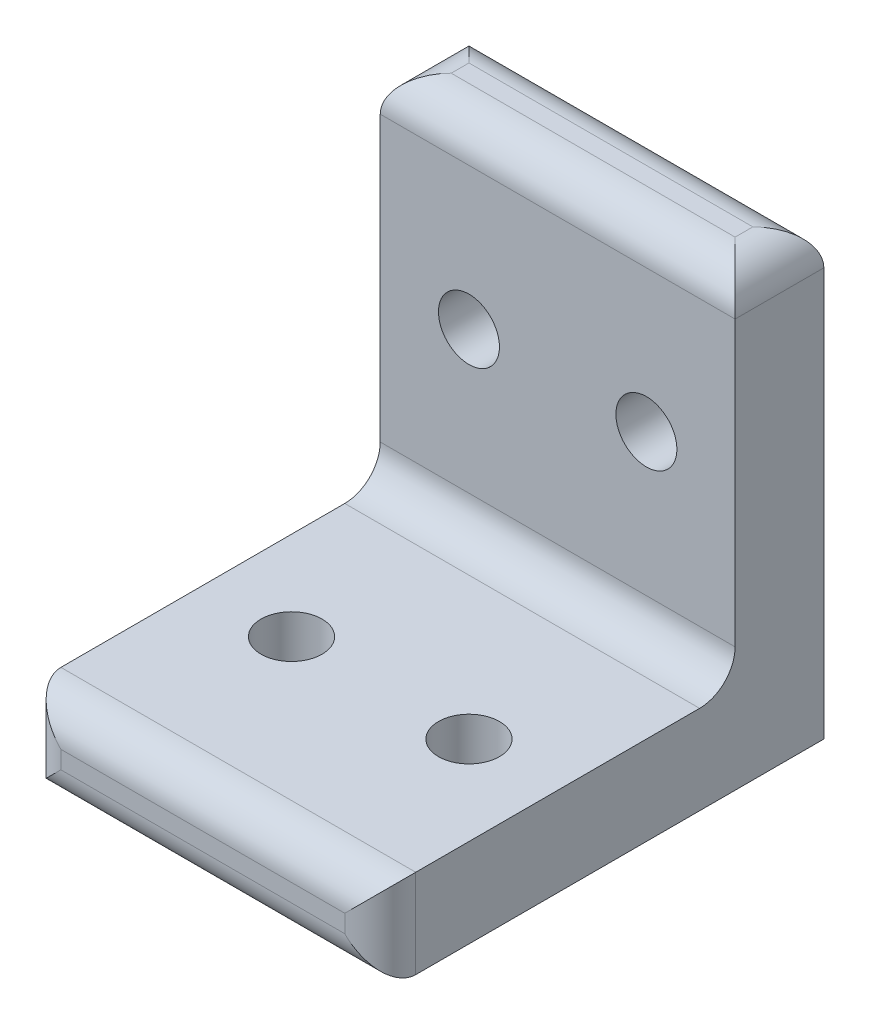
ISO-10303-21;
HEADER;
FILE_DESCRIPTION(('STEP AP214'),'2;1');
FILE_NAME('part.step','',(''),(''),'','','');
FILE_SCHEMA(('AUTOMOTIVE_DESIGN { 1 0 10303 214 1 1 1 1 }'));
ENDSEC;
DATA;
#1=APPLICATION_CONTEXT('core data for automotive mechanical design processes');
#2=APPLICATION_PROTOCOL_DEFINITION('international standard','automotive_design',2000,#1);
#3=PRODUCT_CONTEXT('',#1,'mechanical');
#4=PRODUCT('Part','Part','',(#3));
#5=PRODUCT_RELATED_PRODUCT_CATEGORY('part','',(#4));
#6=PRODUCT_DEFINITION_FORMATION('','',#4);
#7=PRODUCT_DEFINITION_CONTEXT('part definition',#1,'design');
#8=PRODUCT_DEFINITION('design','',#6,#7);
#9=PRODUCT_DEFINITION_SHAPE('','',#8);
#10=(LENGTH_UNIT() NAMED_UNIT(*) SI_UNIT(.MILLI.,.METRE.));
#11=(NAMED_UNIT(*) PLANE_ANGLE_UNIT() SI_UNIT($,.RADIAN.));
#12=(NAMED_UNIT(*) SI_UNIT($,.STERADIAN.) SOLID_ANGLE_UNIT());
#13=UNCERTAINTY_MEASURE_WITH_UNIT(LENGTH_MEASURE(1.E-05),#10,'distance_accuracy_value','');
#14=(GEOMETRIC_REPRESENTATION_CONTEXT(3) GLOBAL_UNCERTAINTY_ASSIGNED_CONTEXT((#13)) GLOBAL_UNIT_ASSIGNED_CONTEXT((#10,
#11,#12)) REPRESENTATION_CONTEXT('',''));
#15=CARTESIAN_POINT('',(0.,0.,0.));
#16=DIRECTION('',(0.,0.,1.));
#17=DIRECTION('',(1.,0.,0.));
#18=AXIS2_PLACEMENT_3D('',#15,#16,#17);
#19=CARTESIAN_POINT('',(12.7,6.35,12.7));
#20=DIRECTION('',(-1.,0.,0.));
#21=DIRECTION('',(0.,0.,1.));
#22=AXIS2_PLACEMENT_3D('',#19,#20,#21);
#23=PLANE('',#22);
#24=DIRECTION('',(0.,-1.,0.));
#25=VECTOR('',#24,1.);
#26=CARTESIAN_POINT('',(12.7,31.75,-19.05));
#27=LINE('',#26,#25);
#28=CARTESIAN_POINT('',(12.7,29.21,-19.05));
#29=VERTEX_POINT('',#28);
#30=CARTESIAN_POINT('',(12.7,0.,-19.05));
#31=VERTEX_POINT('',#30);
#32=EDGE_CURVE('E122',#29,#31,#27,.T.);
#33=ORIENTED_EDGE('',*,*,#32,.F.);
#34=DIRECTION('',(0.,0.,1.));
#35=VECTOR('',#34,1.);
#36=CARTESIAN_POINT('',(12.7,29.21,12.7));
#37=LINE('',#36,#35);
#38=CARTESIAN_POINT('',(12.7,29.21,-12.7));
#39=VERTEX_POINT('',#38);
#40=EDGE_CURVE('E179',#29,#39,#37,.T.);
#41=ORIENTED_EDGE('',*,*,#40,.T.);
#42=DIRECTION('',(0.,-1.,0.));
#43=VECTOR('',#42,1.);
#44=CARTESIAN_POINT('',(12.7,31.75,-12.7));
#45=LINE('',#44,#43);
#46=CARTESIAN_POINT('',(12.7,8.89,-12.7));
#47=VERTEX_POINT('',#46);
#48=EDGE_CURVE('E152',#39,#47,#45,.T.);
#49=ORIENTED_EDGE('',*,*,#48,.T.);
#50=CARTESIAN_POINT('',(12.7,8.89,-10.16));
#51=DIRECTION('',(-1.,0.,0.));
#52=DIRECTION('',(0.,0.,1.));
#53=AXIS2_PLACEMENT_3D('',#50,#51,#52);
#54=CIRCLE('',#53,2.54);
#55=CARTESIAN_POINT('',(12.7,6.35,-10.16));
#56=VERTEX_POINT('',#55);
#57=EDGE_CURVE('E11',#47,#56,#54,.T.);
#58=ORIENTED_EDGE('',*,*,#57,.T.);
#59=DIRECTION('',(0.,0.,-1.));
#60=VECTOR('',#59,1.);
#61=CARTESIAN_POINT('',(12.7,6.35,12.7));
#62=LINE('',#61,#60);
#63=CARTESIAN_POINT('',(12.7,6.35,10.16));
#64=VERTEX_POINT('',#63);
#65=EDGE_CURVE('E156',#64,#56,#62,.T.);
#66=ORIENTED_EDGE('',*,*,#65,.F.);
#67=DIRECTION('',(0.,-1.,0.));
#68=VECTOR('',#67,1.);
#69=CARTESIAN_POINT('',(12.7,6.35,10.16));
#70=LINE('',#69,#68);
#71=CARTESIAN_POINT('',(12.7,0.,10.16));
#72=VERTEX_POINT('',#71);
#73=EDGE_CURVE('E139',#64,#72,#70,.T.);
#74=ORIENTED_EDGE('',*,*,#73,.T.);
#75=DIRECTION('',(0.,0.,-1.));
#76=VECTOR('',#75,1.);
#77=CARTESIAN_POINT('',(12.7,0.,12.7));
#78=LINE('',#77,#76);
#79=EDGE_CURVE('E136',#72,#31,#78,.T.);
#80=ORIENTED_EDGE('',*,*,#79,.T.);
#81=EDGE_LOOP('',(#33,#41,#49,#58,#66,#74,#80));
#82=FACE_BOUND('',#81,.T.);
#83=ADVANCED_FACE('F36',(#82),#23,.F.);
#84=CARTESIAN_POINT('',(-12.7,6.35,12.7));
#85=DIRECTION('',(1.,0.,0.));
#86=DIRECTION('',(0.,0.,-1.));
#87=AXIS2_PLACEMENT_3D('',#84,#85,#86);
#88=PLANE('',#87);
#89=DIRECTION('',(0.,1.,0.));
#90=VECTOR('',#89,1.);
#91=CARTESIAN_POINT('',(-12.7,31.75,-12.7));
#92=LINE('',#91,#90);
#93=CARTESIAN_POINT('',(-12.7,8.89,-12.7));
#94=VERTEX_POINT('',#93);
#95=CARTESIAN_POINT('',(-12.7,29.21,-12.7));
#96=VERTEX_POINT('',#95);
#97=EDGE_CURVE('E149',#94,#96,#92,.T.);
#98=ORIENTED_EDGE('',*,*,#97,.T.);
#99=DIRECTION('',(0.,0.,1.));
#100=VECTOR('',#99,1.);
#101=CARTESIAN_POINT('',(-12.7,29.21,12.7));
#102=LINE('',#101,#100);
#103=CARTESIAN_POINT('',(-12.7,29.21,-19.05));
#104=VERTEX_POINT('',#103);
#105=EDGE_CURVE('E175',#96,#104,#102,.F.);
#106=ORIENTED_EDGE('',*,*,#105,.T.);
#107=DIRECTION('',(0.,1.,0.));
#108=VECTOR('',#107,1.);
#109=CARTESIAN_POINT('',(-12.7,31.75,-19.05));
#110=LINE('',#109,#108);
#111=CARTESIAN_POINT('',(-12.7,0.,-19.05));
#112=VERTEX_POINT('',#111);
#113=EDGE_CURVE('E133',#112,#104,#110,.T.);
#114=ORIENTED_EDGE('',*,*,#113,.F.);
#115=DIRECTION('',(0.,0.,1.));
#116=VECTOR('',#115,1.);
#117=CARTESIAN_POINT('',(-12.7,0.,12.7));
#118=LINE('',#117,#116);
#119=CARTESIAN_POINT('',(-12.7,0.,10.16));
#120=VERTEX_POINT('',#119);
#121=EDGE_CURVE('E142',#112,#120,#118,.T.);
#122=ORIENTED_EDGE('',*,*,#121,.T.);
#123=DIRECTION('',(0.,-1.,0.));
#124=VECTOR('',#123,1.);
#125=CARTESIAN_POINT('',(-12.7,6.35,10.16));
#126=LINE('',#125,#124);
#127=CARTESIAN_POINT('',(-12.7,6.35,10.16));
#128=VERTEX_POINT('',#127);
#129=EDGE_CURVE('E172',#120,#128,#126,.F.);
#130=ORIENTED_EDGE('',*,*,#129,.T.);
#131=DIRECTION('',(0.,0.,1.));
#132=VECTOR('',#131,1.);
#133=CARTESIAN_POINT('',(-12.7,6.35,12.7));
#134=LINE('',#133,#132);
#135=CARTESIAN_POINT('',(-12.7,6.35,-10.16));
#136=VERTEX_POINT('',#135);
#137=EDGE_CURVE('E159',#136,#128,#134,.T.);
#138=ORIENTED_EDGE('',*,*,#137,.F.);
#139=CARTESIAN_POINT('',(-12.7,8.89,-10.16));
#140=DIRECTION('',(1.,0.,0.));
#141=DIRECTION('',(0.,0.,-1.));
#142=AXIS2_PLACEMENT_3D('',#139,#140,#141);
#143=CIRCLE('',#142,2.54);
#144=EDGE_CURVE('E45',#136,#94,#143,.T.);
#145=ORIENTED_EDGE('',*,*,#144,.T.);
#146=EDGE_LOOP('',(#98,#106,#114,#122,#130,#138,#145));
#147=FACE_BOUND('',#146,.T.);
#148=ADVANCED_FACE('F228',(#147),#88,.F.);
#149=CARTESIAN_POINT('',(-12.7,6.35,12.7));
#150=DIRECTION('',(0.,0.,-1.));
#151=DIRECTION('',(-1.,0.,0.));
#152=AXIS2_PLACEMENT_3D('',#149,#150,#151);
#153=PLANE('',#152);
#154=DIRECTION('',(0.,-1.,0.));
#155=VECTOR('',#154,1.);
#156=CARTESIAN_POINT('',(-10.16,6.35,12.7));
#157=LINE('',#156,#155);
#158=CARTESIAN_POINT('',(-10.16,3.81,12.7));
#159=VERTEX_POINT('',#158);
#160=CARTESIAN_POINT('',(-10.16,2.54,12.7));
#161=VERTEX_POINT('',#160);
#162=EDGE_CURVE('E185',#159,#161,#157,.T.);
#163=ORIENTED_EDGE('',*,*,#162,.T.);
#164=DIRECTION('',(1.,0.,0.));
#165=VECTOR('',#164,1.);
#166=CARTESIAN_POINT('',(12.7,2.54,12.7));
#167=LINE('',#166,#165);
#168=CARTESIAN_POINT('',(10.16,2.54,12.7));
#169=VERTEX_POINT('',#168);
#170=EDGE_CURVE('E60',#161,#169,#167,.T.);
#171=ORIENTED_EDGE('',*,*,#170,.T.);
#172=DIRECTION('',(0.,-1.,0.));
#173=VECTOR('',#172,1.);
#174=CARTESIAN_POINT('',(10.16,6.35,12.7));
#175=LINE('',#174,#173);
#176=CARTESIAN_POINT('',(10.16,3.81,12.7));
#177=VERTEX_POINT('',#176);
#178=EDGE_CURVE('E183',#169,#177,#175,.F.);
#179=ORIENTED_EDGE('',*,*,#178,.T.);
#180=DIRECTION('',(1.,0.,0.));
#181=VECTOR('',#180,1.);
#182=CARTESIAN_POINT('',(-12.7,3.81,12.7));
#183=LINE('',#182,#181);
#184=EDGE_CURVE('E181',#177,#159,#183,.F.);
#185=ORIENTED_EDGE('',*,*,#184,.T.);
#186=EDGE_LOOP('',(#163,#171,#179,#185));
#187=FACE_BOUND('',#186,.T.);
#188=ADVANCED_FACE('F231',(#187),#153,.F.);
#189=CARTESIAN_POINT('',(0.,6.35,0.));
#190=DIRECTION('',(0.,-1.,0.));
#191=DIRECTION('',(0.,0.,-1.));
#192=AXIS2_PLACEMENT_3D('',#189,#190,#191);
#193=PLANE('',#192);
#194=CARTESIAN_POINT('',(-6.35,6.35,0.));
#195=DIRECTION('',(0.,1.,0.));
#196=DIRECTION('',(0.,0.,1.));
#197=AXIS2_PLACEMENT_3D('',#194,#195,#196);
#198=CIRCLE('',#197,2.182876);
#199=CARTESIAN_POINT('',(-6.35,6.35,2.182876));
#200=VERTEX_POINT('',#199);
#201=EDGE_CURVE('E486',#200,#200,#198,.T.);
#202=ORIENTED_EDGE('',*,*,#201,.F.);
#203=EDGE_LOOP('',(#202));
#204=FACE_BOUND('',#203,.T.);
#205=CARTESIAN_POINT('',(6.35,6.35,0.));
#206=DIRECTION('',(0.,1.,0.));
#207=DIRECTION('',(0.,0.,1.));
#208=AXIS2_PLACEMENT_3D('',#205,#206,#207);
#209=CIRCLE('',#208,2.182876);
#210=CARTESIAN_POINT('',(6.35,6.35,2.182876));
#211=VERTEX_POINT('',#210);
#212=EDGE_CURVE('E480',#211,#211,#209,.T.);
#213=ORIENTED_EDGE('',*,*,#212,.F.);
#214=EDGE_LOOP('',(#213));
#215=FACE_BOUND('',#214,.T.);
#216=ORIENTED_EDGE('',*,*,#137,.T.);
#217=DIRECTION('',(1.,0.,0.));
#218=VECTOR('',#217,1.);
#219=CARTESIAN_POINT('',(0.,6.35,10.16));
#220=LINE('',#219,#218);
#221=EDGE_CURVE('E198',#128,#64,#220,.T.);
#222=ORIENTED_EDGE('',*,*,#221,.T.);
#223=ORIENTED_EDGE('',*,*,#65,.T.);
#224=DIRECTION('',(-1.,0.,0.));
#225=VECTOR('',#224,1.);
#226=CARTESIAN_POINT('',(-12.7,6.35,-10.16));
#227=LINE('',#226,#225);
#228=EDGE_CURVE('E195',#56,#136,#227,.T.);
#229=ORIENTED_EDGE('',*,*,#228,.T.);
#230=EDGE_LOOP('',(#216,#222,#223,#229));
#231=FACE_BOUND('',#230,.T.);
#232=ADVANCED_FACE('F233',(#204,#215,#231),#193,.F.);
#233=CARTESIAN_POINT('',(0.,0.,0.));
#234=DIRECTION('',(0.,-1.,0.));
#235=DIRECTION('',(0.,0.,-1.));
#236=AXIS2_PLACEMENT_3D('',#233,#234,#235);
#237=PLANE('',#236);
#238=CARTESIAN_POINT('',(-6.35,0.,0.));
#239=DIRECTION('',(0.,1.,0.));
#240=DIRECTION('',(0.,0.,1.));
#241=AXIS2_PLACEMENT_3D('',#238,#239,#240);
#242=CIRCLE('',#241,2.182876);
#243=CARTESIAN_POINT('',(-6.35,0.,2.182876));
#244=VERTEX_POINT('',#243);
#245=EDGE_CURVE('E477',#244,#244,#242,.T.);
#246=ORIENTED_EDGE('',*,*,#245,.T.);
#247=EDGE_LOOP('',(#246));
#248=FACE_BOUND('',#247,.T.);
#249=CARTESIAN_POINT('',(6.35,0.,0.));
#250=DIRECTION('',(0.,1.,0.));
#251=DIRECTION('',(0.,0.,1.));
#252=AXIS2_PLACEMENT_3D('',#249,#250,#251);
#253=CIRCLE('',#252,2.182876);
#254=CARTESIAN_POINT('',(6.35,0.,2.182876));
#255=VERTEX_POINT('',#254);
#256=EDGE_CURVE('E212',#255,#255,#253,.T.);
#257=ORIENTED_EDGE('',*,*,#256,.T.);
#258=EDGE_LOOP('',(#257));
#259=FACE_BOUND('',#258,.T.);
#260=ORIENTED_EDGE('',*,*,#79,.F.);
#261=DIRECTION('',(1.,0.,0.));
#262=VECTOR('',#261,1.);
#263=CARTESIAN_POINT('',(-12.7,0.,10.16));
#264=LINE('',#263,#262);
#265=EDGE_CURVE('E193',#72,#120,#264,.F.);
#266=ORIENTED_EDGE('',*,*,#265,.T.);
#267=ORIENTED_EDGE('',*,*,#121,.F.);
#268=DIRECTION('',(-1.,0.,0.));
#269=VECTOR('',#268,1.);
#270=CARTESIAN_POINT('',(12.7,0.,-19.05));
#271=LINE('',#270,#269);
#272=EDGE_CURVE('E127',#31,#112,#271,.T.);
#273=ORIENTED_EDGE('',*,*,#272,.F.);
#274=EDGE_LOOP('',(#260,#266,#267,#273));
#275=FACE_BOUND('',#274,.T.);
#276=ADVANCED_FACE('F144',(#248,#259,#275),#237,.T.);
#277=CARTESIAN_POINT('',(12.7,31.75,-19.05));
#278=DIRECTION('',(0.,-1.,0.));
#279=DIRECTION('',(0.,0.,-1.));
#280=AXIS2_PLACEMENT_3D('',#277,#278,#279);
#281=PLANE('',#280);
#282=DIRECTION('',(0.,0.,1.));
#283=VECTOR('',#282,1.);
#284=CARTESIAN_POINT('',(10.16,31.75,-19.05));
#285=LINE('',#284,#283);
#286=CARTESIAN_POINT('',(10.16,31.75,-15.24));
#287=VERTEX_POINT('',#286);
#288=CARTESIAN_POINT('',(10.16,31.75,-16.51));
#289=VERTEX_POINT('',#288);
#290=EDGE_CURVE('E165',#287,#289,#285,.F.);
#291=ORIENTED_EDGE('',*,*,#290,.T.);
#292=DIRECTION('',(1.,0.,0.));
#293=VECTOR('',#292,1.);
#294=CARTESIAN_POINT('',(-12.7,31.75,-16.51));
#295=LINE('',#294,#293);
#296=CARTESIAN_POINT('',(-10.16,31.75,-16.51));
#297=VERTEX_POINT('',#296);
#298=EDGE_CURVE('E170',#289,#297,#295,.F.);
#299=ORIENTED_EDGE('',*,*,#298,.T.);
#300=DIRECTION('',(0.,0.,1.));
#301=VECTOR('',#300,1.);
#302=CARTESIAN_POINT('',(-10.16,31.75,-19.05));
#303=LINE('',#302,#301);
#304=CARTESIAN_POINT('',(-10.16,31.75,-15.24));
#305=VERTEX_POINT('',#304);
#306=EDGE_CURVE('E167',#297,#305,#303,.T.);
#307=ORIENTED_EDGE('',*,*,#306,.T.);
#308=DIRECTION('',(1.,0.,0.));
#309=VECTOR('',#308,1.);
#310=CARTESIAN_POINT('',(12.7,31.75,-15.24));
#311=LINE('',#310,#309);
#312=EDGE_CURVE('E161',#305,#287,#311,.T.);
#313=ORIENTED_EDGE('',*,*,#312,.T.);
#314=EDGE_LOOP('',(#291,#299,#307,#313));
#315=FACE_BOUND('',#314,.T.);
#316=ADVANCED_FACE('F410',(#315),#281,.F.);
#317=CARTESIAN_POINT('',(0.,0.,-19.05));
#318=DIRECTION('',(0.,0.,-1.));
#319=DIRECTION('',(-1.,0.,0.));
#320=AXIS2_PLACEMENT_3D('',#317,#318,#319);
#321=PLANE('',#320);
#322=CARTESIAN_POINT('',(6.35,19.05,-19.05));
#323=DIRECTION('',(0.,0.,1.));
#324=DIRECTION('',(1.,0.,0.));
#325=AXIS2_PLACEMENT_3D('',#322,#323,#324);
#326=CIRCLE('',#325,2.182876);
#327=CARTESIAN_POINT('',(8.532876,19.05,-19.05));
#328=VERTEX_POINT('',#327);
#329=EDGE_CURVE('E495',#328,#328,#326,.T.);
#330=ORIENTED_EDGE('',*,*,#329,.T.);
#331=EDGE_LOOP('',(#330));
#332=FACE_BOUND('',#331,.T.);
#333=CARTESIAN_POINT('',(-6.35,19.05,-19.05));
#334=DIRECTION('',(0.,0.,1.));
#335=DIRECTION('',(1.,0.,0.));
#336=AXIS2_PLACEMENT_3D('',#333,#334,#335);
#337=CIRCLE('',#336,2.182876);
#338=CARTESIAN_POINT('',(-4.167124,19.05,-19.05));
#339=VERTEX_POINT('',#338);
#340=EDGE_CURVE('E489',#339,#339,#337,.T.);
#341=ORIENTED_EDGE('',*,*,#340,.T.);
#342=EDGE_LOOP('',(#341));
#343=FACE_BOUND('',#342,.T.);
#344=ORIENTED_EDGE('',*,*,#113,.T.);
#345=DIRECTION('',(1.,0.,0.));
#346=VECTOR('',#345,1.);
#347=CARTESIAN_POINT('',(12.7,29.21,-19.05));
#348=LINE('',#347,#346);
#349=EDGE_CURVE('E130',#104,#29,#348,.T.);
#350=ORIENTED_EDGE('',*,*,#349,.T.);
#351=ORIENTED_EDGE('',*,*,#32,.T.);
#352=ORIENTED_EDGE('',*,*,#272,.T.);
#353=EDGE_LOOP('',(#344,#350,#351,#352));
#354=FACE_BOUND('',#353,.T.);
#355=ADVANCED_FACE('F125',(#332,#343,#354),#321,.T.);
#356=CARTESIAN_POINT('',(0.,0.,-12.7));
#357=DIRECTION('',(0.,0.,-1.));
#358=DIRECTION('',(-1.,0.,0.));
#359=AXIS2_PLACEMENT_3D('',#356,#357,#358);
#360=PLANE('',#359);
#361=CARTESIAN_POINT('',(6.35,19.05,-12.7));
#362=DIRECTION('',(0.,0.,1.));
#363=DIRECTION('',(1.,0.,0.));
#364=AXIS2_PLACEMENT_3D('',#361,#362,#363);
#365=CIRCLE('',#364,2.182876);
#366=CARTESIAN_POINT('',(8.532876,19.05,-12.7));
#367=VERTEX_POINT('',#366);
#368=EDGE_CURVE('E498',#367,#367,#365,.T.);
#369=ORIENTED_EDGE('',*,*,#368,.F.);
#370=EDGE_LOOP('',(#369));
#371=FACE_BOUND('',#370,.T.);
#372=CARTESIAN_POINT('',(-6.35,19.05,-12.7));
#373=DIRECTION('',(0.,0.,1.));
#374=DIRECTION('',(1.,0.,0.));
#375=AXIS2_PLACEMENT_3D('',#372,#373,#374);
#376=CIRCLE('',#375,2.182876);
#377=CARTESIAN_POINT('',(-4.167124,19.05,-12.7));
#378=VERTEX_POINT('',#377);
#379=EDGE_CURVE('E492',#378,#378,#376,.T.);
#380=ORIENTED_EDGE('',*,*,#379,.F.);
#381=EDGE_LOOP('',(#380));
#382=FACE_BOUND('',#381,.T.);
#383=ORIENTED_EDGE('',*,*,#48,.F.);
#384=DIRECTION('',(1.,0.,0.));
#385=VECTOR('',#384,1.);
#386=CARTESIAN_POINT('',(0.,29.21,-12.7));
#387=LINE('',#386,#385);
#388=EDGE_CURVE('E191',#39,#96,#387,.F.);
#389=ORIENTED_EDGE('',*,*,#388,.T.);
#390=ORIENTED_EDGE('',*,*,#97,.F.);
#391=DIRECTION('',(-1.,0.,0.));
#392=VECTOR('',#391,1.);
#393=CARTESIAN_POINT('',(12.7,8.89,-12.7));
#394=LINE('',#393,#392);
#395=EDGE_CURVE('E189',#94,#47,#394,.F.);
#396=ORIENTED_EDGE('',*,*,#395,.T.);
#397=EDGE_LOOP('',(#383,#389,#390,#396));
#398=FACE_BOUND('',#397,.T.);
#399=ADVANCED_FACE('F263',(#371,#382,#398),#360,.F.);
#400=CARTESIAN_POINT('',(10.16,29.21,12.7));
#401=DIRECTION('',(0.,0.,1.));
#402=DIRECTION('',(1.,0.,0.));
#403=AXIS2_PLACEMENT_3D('',#400,#401,#402);
#404=CYLINDRICAL_SURFACE('',#403,2.54);
#405=CARTESIAN_POINT('',(10.16,29.21,-15.24));
#406=DIRECTION('',(0.707106781186547,0.,-0.707106781186547));
#407=DIRECTION('',(0.707106781186547,0.,0.707106781186547));
#408=AXIS2_PLACEMENT_3D('',#405,#406,#407);
#409=ELLIPSE('',#408,3.59210244842766,2.54);
#410=EDGE_CURVE('E205',#39,#287,#409,.F.);
#411=ORIENTED_EDGE('',*,*,#410,.F.);
#412=ORIENTED_EDGE('',*,*,#40,.F.);
#413=CARTESIAN_POINT('',(10.16,29.21,-16.51));
#414=DIRECTION('',(-0.707106781186547,0.,-0.707106781186547));
#415=DIRECTION('',(-0.707106781186547,0.,0.707106781186547));
#416=AXIS2_PLACEMENT_3D('',#413,#414,#415);
#417=ELLIPSE('',#416,3.59210244842766,2.54);
#418=EDGE_CURVE('E153',#289,#29,#417,.T.);
#419=ORIENTED_EDGE('',*,*,#418,.F.);
#420=ORIENTED_EDGE('',*,*,#290,.F.);
#421=EDGE_LOOP('',(#411,#412,#419,#420));
#422=FACE_BOUND('',#421,.T.);
#423=ADVANCED_FACE('F259',(#422),#404,.T.);
#424=CARTESIAN_POINT('',(0.,29.21,-16.51));
#425=DIRECTION('',(-1.,0.,0.));
#426=DIRECTION('',(0.,0.,1.));
#427=AXIS2_PLACEMENT_3D('',#424,#425,#426);
#428=CYLINDRICAL_SURFACE('',#427,2.54);
#429=ORIENTED_EDGE('',*,*,#418,.T.);
#430=ORIENTED_EDGE('',*,*,#349,.F.);
#431=CARTESIAN_POINT('',(-10.16,29.21,-16.51));
#432=DIRECTION('',(-0.707106781186547,0.,0.707106781186547));
#433=DIRECTION('',(-0.707106781186547,0.,-0.707106781186547));
#434=AXIS2_PLACEMENT_3D('',#431,#432,#433);
#435=ELLIPSE('',#434,3.59210244842766,2.54);
#436=EDGE_CURVE('E203',#297,#104,#435,.T.);
#437=ORIENTED_EDGE('',*,*,#436,.F.);
#438=ORIENTED_EDGE('',*,*,#298,.F.);
#439=EDGE_LOOP('',(#429,#430,#437,#438));
#440=FACE_BOUND('',#439,.T.);
#441=ADVANCED_FACE('F255',(#440),#428,.T.);
#442=CARTESIAN_POINT('',(12.7,29.21,-15.24));
#443=DIRECTION('',(1.,0.,0.));
#444=DIRECTION('',(0.,0.,-1.));
#445=AXIS2_PLACEMENT_3D('',#442,#443,#444);
#446=CYLINDRICAL_SURFACE('',#445,2.54);
#447=ORIENTED_EDGE('',*,*,#410,.T.);
#448=ORIENTED_EDGE('',*,*,#312,.F.);
#449=CARTESIAN_POINT('',(-10.16,29.21,-15.24));
#450=DIRECTION('',(0.707106781186547,0.,0.707106781186547));
#451=DIRECTION('',(0.707106781186547,0.,-0.707106781186547));
#452=AXIS2_PLACEMENT_3D('',#449,#450,#451);
#453=ELLIPSE('',#452,3.59210244842766,2.54);
#454=EDGE_CURVE('E201',#96,#305,#453,.F.);
#455=ORIENTED_EDGE('',*,*,#454,.F.);
#456=ORIENTED_EDGE('',*,*,#388,.F.);
#457=EDGE_LOOP('',(#447,#448,#455,#456));
#458=FACE_BOUND('',#457,.T.);
#459=ADVANCED_FACE('F251',(#458),#446,.T.);
#460=CARTESIAN_POINT('',(-10.16,29.21,-19.05));
#461=DIRECTION('',(0.,0.,1.));
#462=DIRECTION('',(1.,0.,0.));
#463=AXIS2_PLACEMENT_3D('',#460,#461,#462);
#464=CYLINDRICAL_SURFACE('',#463,2.54);
#465=ORIENTED_EDGE('',*,*,#436,.T.);
#466=ORIENTED_EDGE('',*,*,#105,.F.);
#467=ORIENTED_EDGE('',*,*,#454,.T.);
#468=ORIENTED_EDGE('',*,*,#306,.F.);
#469=EDGE_LOOP('',(#465,#466,#467,#468));
#470=FACE_BOUND('',#469,.T.);
#471=ADVANCED_FACE('F248',(#470),#464,.T.);
#472=CARTESIAN_POINT('',(10.16,6.35,10.16));
#473=DIRECTION('',(0.,-1.,0.));
#474=DIRECTION('',(0.,0.,-1.));
#475=AXIS2_PLACEMENT_3D('',#472,#473,#474);
#476=CYLINDRICAL_SURFACE('',#475,2.54);
#477=CARTESIAN_POINT('',(10.16,2.54,10.16));
#478=DIRECTION('',(-0.707106781186547,-0.707106781186547,0.));
#479=DIRECTION('',(-0.707106781186547,0.707106781186547,0.));
#480=AXIS2_PLACEMENT_3D('',#477,#478,#479);
#481=ELLIPSE('',#480,3.59210244842766,2.54);
#482=EDGE_CURVE('E213',#72,#169,#481,.T.);
#483=ORIENTED_EDGE('',*,*,#482,.F.);
#484=ORIENTED_EDGE('',*,*,#73,.F.);
#485=CARTESIAN_POINT('',(10.16,3.81,10.16));
#486=DIRECTION('',(0.707106781186547,-0.707106781186547,0.));
#487=DIRECTION('',(0.707106781186547,0.707106781186547,0.));
#488=AXIS2_PLACEMENT_3D('',#485,#486,#487);
#489=ELLIPSE('',#488,3.59210244842766,2.54);
#490=EDGE_CURVE('E40',#177,#64,#489,.F.);
#491=ORIENTED_EDGE('',*,*,#490,.F.);
#492=ORIENTED_EDGE('',*,*,#178,.F.);
#493=EDGE_LOOP('',(#483,#484,#491,#492));
#494=FACE_BOUND('',#493,.T.);
#495=ADVANCED_FACE('F225',(#494),#476,.T.);
#496=CARTESIAN_POINT('',(0.,3.81,10.16));
#497=DIRECTION('',(1.,0.,0.));
#498=DIRECTION('',(0.,0.,-1.));
#499=AXIS2_PLACEMENT_3D('',#496,#497,#498);
#500=CYLINDRICAL_SURFACE('',#499,2.54);
#501=ORIENTED_EDGE('',*,*,#490,.T.);
#502=ORIENTED_EDGE('',*,*,#221,.F.);
#503=CARTESIAN_POINT('',(-10.16,3.81,10.16));
#504=DIRECTION('',(0.707106781186547,0.707106781186547,0.));
#505=DIRECTION('',(0.707106781186547,-0.707106781186547,0.));
#506=AXIS2_PLACEMENT_3D('',#503,#504,#505);
#507=ELLIPSE('',#506,3.59210244842766,2.54);
#508=EDGE_CURVE('E211',#159,#128,#507,.F.);
#509=ORIENTED_EDGE('',*,*,#508,.F.);
#510=ORIENTED_EDGE('',*,*,#184,.F.);
#511=EDGE_LOOP('',(#501,#502,#509,#510));
#512=FACE_BOUND('',#511,.T.);
#513=ADVANCED_FACE('F222',(#512),#500,.T.);
#514=CARTESIAN_POINT('',(-12.7,2.54,10.16));
#515=DIRECTION('',(-1.,0.,0.));
#516=DIRECTION('',(0.,0.,1.));
#517=AXIS2_PLACEMENT_3D('',#514,#515,#516);
#518=CYLINDRICAL_SURFACE('',#517,2.54);
#519=ORIENTED_EDGE('',*,*,#482,.T.);
#520=ORIENTED_EDGE('',*,*,#170,.F.);
#521=CARTESIAN_POINT('',(-10.16,2.54,10.16));
#522=DIRECTION('',(-0.707106781186547,0.707106781186547,0.));
#523=DIRECTION('',(-0.707106781186547,-0.707106781186547,0.));
#524=AXIS2_PLACEMENT_3D('',#521,#522,#523);
#525=ELLIPSE('',#524,3.59210244842766,2.54);
#526=EDGE_CURVE('E53',#120,#161,#525,.T.);
#527=ORIENTED_EDGE('',*,*,#526,.F.);
#528=ORIENTED_EDGE('',*,*,#265,.F.);
#529=EDGE_LOOP('',(#519,#520,#527,#528));
#530=FACE_BOUND('',#529,.T.);
#531=ADVANCED_FACE('F226',(#530),#518,.T.);
#532=CARTESIAN_POINT('',(-10.16,6.35,10.16));
#533=DIRECTION('',(0.,-1.,0.));
#534=DIRECTION('',(0.,0.,-1.));
#535=AXIS2_PLACEMENT_3D('',#532,#533,#534);
#536=CYLINDRICAL_SURFACE('',#535,2.54);
#537=ORIENTED_EDGE('',*,*,#508,.T.);
#538=ORIENTED_EDGE('',*,*,#129,.F.);
#539=ORIENTED_EDGE('',*,*,#526,.T.);
#540=ORIENTED_EDGE('',*,*,#162,.F.);
#541=EDGE_LOOP('',(#537,#538,#539,#540));
#542=FACE_BOUND('',#541,.T.);
#543=ADVANCED_FACE('F230',(#542),#536,.T.);
#544=CARTESIAN_POINT('',(0.,8.89,-10.16));
#545=DIRECTION('',(1.,0.,0.));
#546=DIRECTION('',(0.,0.,-1.));
#547=AXIS2_PLACEMENT_3D('',#544,#545,#546);
#548=CYLINDRICAL_SURFACE('',#547,2.54);
#549=ORIENTED_EDGE('',*,*,#57,.F.);
#550=ORIENTED_EDGE('',*,*,#395,.F.);
#551=ORIENTED_EDGE('',*,*,#144,.F.);
#552=ORIENTED_EDGE('',*,*,#228,.F.);
#553=EDGE_LOOP('',(#549,#550,#551,#552));
#554=FACE_BOUND('',#553,.T.);
#555=ADVANCED_FACE('F38',(#554),#548,.F.);
#556=CARTESIAN_POINT('',(6.35,6.35,0.));
#557=DIRECTION('',(0.,1.,0.));
#558=DIRECTION('',(0.,0.,1.));
#559=AXIS2_PLACEMENT_3D('',#556,#557,#558);
#560=CYLINDRICAL_SURFACE('',#559,2.182876);
#561=ORIENTED_EDGE('',*,*,#256,.F.);
#562=EDGE_LOOP('',(#561));
#563=FACE_BOUND('',#562,.T.);
#564=ORIENTED_EDGE('',*,*,#212,.T.);
#565=EDGE_LOOP('',(#564));
#566=FACE_BOUND('',#565,.T.);
#567=ADVANCED_FACE('F293',(#563,#566),#560,.F.);
#568=CARTESIAN_POINT('',(-6.35,6.35,0.));
#569=DIRECTION('',(0.,1.,0.));
#570=DIRECTION('',(0.,0.,1.));
#571=AXIS2_PLACEMENT_3D('',#568,#569,#570);
#572=CYLINDRICAL_SURFACE('',#571,2.182876);
#573=ORIENTED_EDGE('',*,*,#245,.F.);
#574=EDGE_LOOP('',(#573));
#575=FACE_BOUND('',#574,.T.);
#576=ORIENTED_EDGE('',*,*,#201,.T.);
#577=EDGE_LOOP('',(#576));
#578=FACE_BOUND('',#577,.T.);
#579=ADVANCED_FACE('F301',(#575,#578),#572,.F.);
#580=CARTESIAN_POINT('',(-6.35,19.05,-12.7));
#581=DIRECTION('',(0.,0.,1.));
#582=DIRECTION('',(1.,0.,0.));
#583=AXIS2_PLACEMENT_3D('',#580,#581,#582);
#584=CYLINDRICAL_SURFACE('',#583,2.182876);
#585=ORIENTED_EDGE('',*,*,#340,.F.);
#586=EDGE_LOOP('',(#585));
#587=FACE_BOUND('',#586,.T.);
#588=ORIENTED_EDGE('',*,*,#379,.T.);
#589=EDGE_LOOP('',(#588));
#590=FACE_BOUND('',#589,.T.);
#591=ADVANCED_FACE('F310',(#587,#590),#584,.F.);
#592=CARTESIAN_POINT('',(6.35,19.05,-12.7));
#593=DIRECTION('',(0.,0.,1.));
#594=DIRECTION('',(1.,0.,0.));
#595=AXIS2_PLACEMENT_3D('',#592,#593,#594);
#596=CYLINDRICAL_SURFACE('',#595,2.182876);
#597=ORIENTED_EDGE('',*,*,#329,.F.);
#598=EDGE_LOOP('',(#597));
#599=FACE_BOUND('',#598,.T.);
#600=ORIENTED_EDGE('',*,*,#368,.T.);
#601=EDGE_LOOP('',(#600));
#602=FACE_BOUND('',#601,.T.);
#603=ADVANCED_FACE('F319',(#599,#602),#596,.F.);
#604=CLOSED_SHELL('',(#83,#148,#188,#232,#276,#316,#355,#399,#423,#441,#459,#471,#495,#513,#531,
#543,#555,#567,#579,#591,#603));
#605=MANIFOLD_SOLID_BREP('B2',#604);
#606=ADVANCED_BREP_SHAPE_REPRESENTATION('',(#18,#605),#14);
#607=SHAPE_DEFINITION_REPRESENTATION(#9,#606);
ENDSEC;
END-ISO-10303-21;
